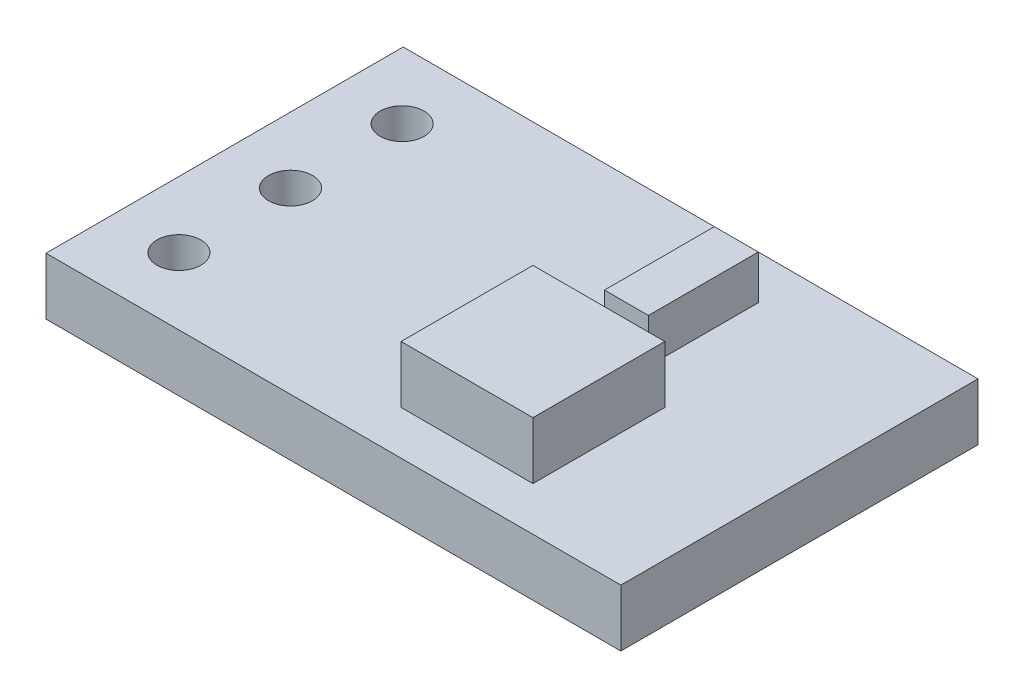
ISO-10303-21;
HEADER;
FILE_DESCRIPTION(('STEP AP214'),'2;1');
FILE_NAME('part.step','',(''),(''),'','','');
FILE_SCHEMA(('AUTOMOTIVE_DESIGN { 1 0 10303 214 1 1 1 1 }'));
ENDSEC;
DATA;
#1=APPLICATION_CONTEXT('core data for automotive mechanical design processes');
#2=APPLICATION_PROTOCOL_DEFINITION('international standard','automotive_design',2000,#1);
#3=PRODUCT_CONTEXT('',#1,'mechanical');
#4=PRODUCT('Part','Part','',(#3));
#5=PRODUCT_RELATED_PRODUCT_CATEGORY('part','',(#4));
#6=PRODUCT_DEFINITION_FORMATION('','',#4);
#7=PRODUCT_DEFINITION_CONTEXT('part definition',#1,'design');
#8=PRODUCT_DEFINITION('design','',#6,#7);
#9=PRODUCT_DEFINITION_SHAPE('','',#8);
#10=(LENGTH_UNIT() NAMED_UNIT(*) SI_UNIT(.MILLI.,.METRE.));
#11=(NAMED_UNIT(*) PLANE_ANGLE_UNIT() SI_UNIT($,.RADIAN.));
#12=(NAMED_UNIT(*) SI_UNIT($,.STERADIAN.) SOLID_ANGLE_UNIT());
#13=UNCERTAINTY_MEASURE_WITH_UNIT(LENGTH_MEASURE(1.E-05),#10,'distance_accuracy_value','');
#14=(GEOMETRIC_REPRESENTATION_CONTEXT(3) GLOBAL_UNCERTAINTY_ASSIGNED_CONTEXT((#13)) GLOBAL_UNIT_ASSIGNED_CONTEXT((#10,
#11,#12)) REPRESENTATION_CONTEXT('',''));
#15=CARTESIAN_POINT('',(0.,0.,0.));
#16=DIRECTION('',(0.,0.,1.));
#17=DIRECTION('',(1.,0.,0.));
#18=AXIS2_PLACEMENT_3D('',#15,#16,#17);
#19=CARTESIAN_POINT('',(0.,1.3,0.));
#20=DIRECTION('',(0.,1.,0.));
#21=DIRECTION('',(0.,0.,1.));
#22=AXIS2_PLACEMENT_3D('',#19,#20,#21);
#23=PLANE('',#22);
#24=CARTESIAN_POINT('',(-5.0405,1.3,0.));
#25=DIRECTION('',(0.,1.,0.));
#26=DIRECTION('',(0.,0.,1.));
#27=AXIS2_PLACEMENT_3D('',#24,#25,#26);
#28=CIRCLE('',#27,0.500000000000001);
#29=CARTESIAN_POINT('',(-5.0405,1.3,0.500000000000002));
#30=VERTEX_POINT('',#29);
#31=EDGE_CURVE('E185',#30,#30,#28,.T.);
#32=ORIENTED_EDGE('',*,*,#31,.F.);
#33=EDGE_LOOP('',(#32));
#34=FACE_BOUND('',#33,.T.);
#35=DIRECTION('',(0.,0.,1.));
#36=VECTOR('',#35,1.);
#37=CARTESIAN_POINT('',(-6.5405,1.3,4.064));
#38=LINE('',#37,#36);
#39=CARTESIAN_POINT('',(-6.5405,1.3,-4.064));
#40=VERTEX_POINT('',#39);
#41=CARTESIAN_POINT('',(-6.5405,1.3,4.064));
#42=VERTEX_POINT('',#41);
#43=EDGE_CURVE('E197',#40,#42,#38,.T.);
#44=ORIENTED_EDGE('',*,*,#43,.T.);
#45=DIRECTION('',(1.,0.,0.));
#46=VECTOR('',#45,1.);
#47=CARTESIAN_POINT('',(6.5405,1.3,4.064));
#48=LINE('',#47,#46);
#49=CARTESIAN_POINT('',(6.5405,1.3,4.064));
#50=VERTEX_POINT('',#49);
#51=EDGE_CURVE('E200',#42,#50,#48,.T.);
#52=ORIENTED_EDGE('',*,*,#51,.T.);
#53=DIRECTION('',(0.,0.,-1.));
#54=VECTOR('',#53,1.);
#55=CARTESIAN_POINT('',(6.5405,1.3,4.064));
#56=LINE('',#55,#54);
#57=CARTESIAN_POINT('',(6.5405,1.3,-4.064));
#58=VERTEX_POINT('',#57);
#59=EDGE_CURVE('E203',#50,#58,#56,.T.);
#60=ORIENTED_EDGE('',*,*,#59,.T.);
#61=DIRECTION('',(-1.,0.,0.));
#62=VECTOR('',#61,1.);
#63=CARTESIAN_POINT('',(6.5405,1.3,-4.064));
#64=LINE('',#63,#62);
#65=EDGE_CURVE('E205',#58,#40,#64,.T.);
#66=ORIENTED_EDGE('',*,*,#65,.T.);
#67=EDGE_LOOP('',(#44,#52,#60,#66));
#68=FACE_BOUND('',#67,.T.);
#69=CARTESIAN_POINT('',(-5.0405,1.3,-2.54));
#70=DIRECTION('',(0.,1.,0.));
#71=DIRECTION('',(0.,0.,1.));
#72=AXIS2_PLACEMENT_3D('',#69,#70,#71);
#73=CIRCLE('',#72,0.5);
#74=CARTESIAN_POINT('',(-5.0405,1.3,-2.04));
#75=VERTEX_POINT('',#74);
#76=EDGE_CURVE('E191',#75,#75,#73,.T.);
#77=ORIENTED_EDGE('',*,*,#76,.F.);
#78=EDGE_LOOP('',(#77));
#79=FACE_BOUND('',#78,.T.);
#80=CARTESIAN_POINT('',(-5.0405,1.3,2.54));
#81=DIRECTION('',(0.,1.,0.));
#82=DIRECTION('',(0.,0.,1.));
#83=AXIS2_PLACEMENT_3D('',#80,#81,#82);
#84=CIRCLE('',#83,0.500000000000001);
#85=CARTESIAN_POINT('',(-5.0405,1.3,3.04));
#86=VERTEX_POINT('',#85);
#87=EDGE_CURVE('E179',#86,#86,#84,.T.);
#88=ORIENTED_EDGE('',*,*,#87,.F.);
#89=EDGE_LOOP('',(#88));
#90=FACE_BOUND('',#89,.T.);
#91=DIRECTION('',(1.,0.,0.));
#92=VECTOR('',#91,1.);
#93=CARTESIAN_POINT('',(3.5405,1.3,3.064));
#94=LINE('',#93,#92);
#95=CARTESIAN_POINT('',(0.540500000000002,1.3,3.064));
#96=VERTEX_POINT('',#95);
#97=CARTESIAN_POINT('',(3.5405,1.3,3.064));
#98=VERTEX_POINT('',#97);
#99=EDGE_CURVE('E150',#96,#98,#94,.T.);
#100=ORIENTED_EDGE('',*,*,#99,.F.);
#101=DIRECTION('',(0.,0.,1.));
#102=VECTOR('',#101,1.);
#103=CARTESIAN_POINT('',(0.540500000000002,1.3,0.0640000000000027));
#104=LINE('',#103,#102);
#105=CARTESIAN_POINT('',(0.540500000000002,1.3,0.0640000000000027));
#106=VERTEX_POINT('',#105);
#107=EDGE_CURVE('E147',#106,#96,#104,.T.);
#108=ORIENTED_EDGE('',*,*,#107,.F.);
#109=DIRECTION('',(-1.,0.,0.));
#110=VECTOR('',#109,1.);
#111=CARTESIAN_POINT('',(3.5405,1.3,0.0640000000000023));
#112=LINE('',#111,#110);
#113=CARTESIAN_POINT('',(3.5405,1.3,0.0640000000000023));
#114=VERTEX_POINT('',#113);
#115=EDGE_CURVE('E159',#114,#106,#112,.T.);
#116=ORIENTED_EDGE('',*,*,#115,.F.);
#117=DIRECTION('',(0.,0.,-1.));
#118=VECTOR('',#117,1.);
#119=CARTESIAN_POINT('',(3.5405,1.3,0.0640000000000023));
#120=LINE('',#119,#118);
#121=EDGE_CURVE('E167',#98,#114,#120,.T.);
#122=ORIENTED_EDGE('',*,*,#121,.F.);
#123=EDGE_LOOP('',(#100,#108,#116,#122));
#124=FACE_BOUND('',#123,.T.);
#125=DIRECTION('',(1.,0.,0.));
#126=VECTOR('',#125,1.);
#127=CARTESIAN_POINT('',(2.5405,1.3,-0.563999999999999));
#128=LINE('',#127,#126);
#129=CARTESIAN_POINT('',(1.5405,1.3,-0.563999999999999));
#130=VERTEX_POINT('',#129);
#131=CARTESIAN_POINT('',(2.5405,1.3,-0.563999999999999));
#132=VERTEX_POINT('',#131);
#133=EDGE_CURVE('E427',#130,#132,#128,.T.);
#134=ORIENTED_EDGE('',*,*,#133,.F.);
#135=DIRECTION('',(0.,0.,1.));
#136=VECTOR('',#135,1.);
#137=CARTESIAN_POINT('',(1.5405,1.3,-3.064));
#138=LINE('',#137,#136);
#139=CARTESIAN_POINT('',(1.5405,1.3,-3.064));
#140=VERTEX_POINT('',#139);
#141=EDGE_CURVE('E145',#140,#130,#138,.T.);
#142=ORIENTED_EDGE('',*,*,#141,.F.);
#143=DIRECTION('',(-1.,0.,0.));
#144=VECTOR('',#143,1.);
#145=CARTESIAN_POINT('',(2.5405,1.3,-3.064));
#146=LINE('',#145,#144);
#147=CARTESIAN_POINT('',(2.5405,1.3,-3.064));
#148=VERTEX_POINT('',#147);
#149=EDGE_CURVE('E141',#148,#140,#146,.T.);
#150=ORIENTED_EDGE('',*,*,#149,.F.);
#151=DIRECTION('',(0.,0.,-1.));
#152=VECTOR('',#151,1.);
#153=CARTESIAN_POINT('',(2.5405,1.3,-3.064));
#154=LINE('',#153,#152);
#155=EDGE_CURVE('E424',#132,#148,#154,.T.);
#156=ORIENTED_EDGE('',*,*,#155,.F.);
#157=EDGE_LOOP('',(#134,#142,#150,#156));
#158=FACE_BOUND('',#157,.T.);
#159=ADVANCED_FACE('F32',(#34,#68,#79,#90,#124,#158),#23,.T.);
#160=CARTESIAN_POINT('',(0.,0.,0.));
#161=DIRECTION('',(0.,1.,0.));
#162=DIRECTION('',(0.,0.,1.));
#163=AXIS2_PLACEMENT_3D('',#160,#161,#162);
#164=PLANE('',#163);
#165=DIRECTION('',(0.,0.,1.));
#166=VECTOR('',#165,1.);
#167=CARTESIAN_POINT('',(-6.5405,0.,4.064));
#168=LINE('',#167,#166);
#169=CARTESIAN_POINT('',(-6.5405,0.,-4.064));
#170=VERTEX_POINT('',#169);
#171=CARTESIAN_POINT('',(-6.5405,0.,4.064));
#172=VERTEX_POINT('',#171);
#173=EDGE_CURVE('E194',#170,#172,#168,.T.);
#174=ORIENTED_EDGE('',*,*,#173,.F.);
#175=DIRECTION('',(-1.,0.,0.));
#176=VECTOR('',#175,1.);
#177=CARTESIAN_POINT('',(6.5405,0.,-4.064));
#178=LINE('',#177,#176);
#179=CARTESIAN_POINT('',(6.5405,0.,-4.064));
#180=VERTEX_POINT('',#179);
#181=EDGE_CURVE('E201',#180,#170,#178,.T.);
#182=ORIENTED_EDGE('',*,*,#181,.F.);
#183=DIRECTION('',(0.,0.,-1.));
#184=VECTOR('',#183,1.);
#185=CARTESIAN_POINT('',(6.5405,0.,4.064));
#186=LINE('',#185,#184);
#187=CARTESIAN_POINT('',(6.5405,0.,4.064));
#188=VERTEX_POINT('',#187);
#189=EDGE_CURVE('E212',#188,#180,#186,.T.);
#190=ORIENTED_EDGE('',*,*,#189,.F.);
#191=DIRECTION('',(1.,0.,0.));
#192=VECTOR('',#191,1.);
#193=CARTESIAN_POINT('',(6.5405,0.,4.064));
#194=LINE('',#193,#192);
#195=EDGE_CURVE('E210',#172,#188,#194,.T.);
#196=ORIENTED_EDGE('',*,*,#195,.F.);
#197=EDGE_LOOP('',(#174,#182,#190,#196));
#198=FACE_BOUND('',#197,.T.);
#199=CARTESIAN_POINT('',(-5.0405,0.,-2.54));
#200=DIRECTION('',(0.,1.,0.));
#201=DIRECTION('',(0.,0.,1.));
#202=AXIS2_PLACEMENT_3D('',#199,#200,#201);
#203=CIRCLE('',#202,0.5);
#204=CARTESIAN_POINT('',(-5.0405,0.,-2.04));
#205=VERTEX_POINT('',#204);
#206=EDGE_CURVE('E188',#205,#205,#203,.T.);
#207=ORIENTED_EDGE('',*,*,#206,.T.);
#208=EDGE_LOOP('',(#207));
#209=FACE_BOUND('',#208,.T.);
#210=CARTESIAN_POINT('',(-5.0405,0.,0.));
#211=DIRECTION('',(0.,1.,0.));
#212=DIRECTION('',(0.,0.,1.));
#213=AXIS2_PLACEMENT_3D('',#210,#211,#212);
#214=CIRCLE('',#213,0.500000000000001);
#215=CARTESIAN_POINT('',(-5.0405,0.,0.500000000000002));
#216=VERTEX_POINT('',#215);
#217=EDGE_CURVE('E182',#216,#216,#214,.T.);
#218=ORIENTED_EDGE('',*,*,#217,.T.);
#219=EDGE_LOOP('',(#218));
#220=FACE_BOUND('',#219,.T.);
#221=CARTESIAN_POINT('',(-5.0405,0.,2.54));
#222=DIRECTION('',(0.,1.,0.));
#223=DIRECTION('',(0.,0.,1.));
#224=AXIS2_PLACEMENT_3D('',#221,#222,#223);
#225=CIRCLE('',#224,0.500000000000001);
#226=CARTESIAN_POINT('',(-5.0405,0.,3.04));
#227=VERTEX_POINT('',#226);
#228=EDGE_CURVE('E178',#227,#227,#225,.T.);
#229=ORIENTED_EDGE('',*,*,#228,.T.);
#230=EDGE_LOOP('',(#229));
#231=FACE_BOUND('',#230,.T.);
#232=ADVANCED_FACE('F230',(#198,#209,#220,#231),#164,.F.);
#233=CARTESIAN_POINT('',(-6.5405,1.3,4.064));
#234=DIRECTION('',(1.,0.,0.));
#235=DIRECTION('',(0.,0.,-1.));
#236=AXIS2_PLACEMENT_3D('',#233,#234,#235);
#237=PLANE('',#236);
#238=ORIENTED_EDGE('',*,*,#173,.T.);
#239=DIRECTION('',(0.,-1.,0.));
#240=VECTOR('',#239,1.);
#241=CARTESIAN_POINT('',(-6.5405,1.3,4.064));
#242=LINE('',#241,#240);
#243=EDGE_CURVE('E11',#42,#172,#242,.T.);
#244=ORIENTED_EDGE('',*,*,#243,.F.);
#245=ORIENTED_EDGE('',*,*,#43,.F.);
#246=DIRECTION('',(0.,-1.,0.));
#247=VECTOR('',#246,1.);
#248=CARTESIAN_POINT('',(-6.5405,1.3,-4.064));
#249=LINE('',#248,#247);
#250=EDGE_CURVE('E207',#40,#170,#249,.T.);
#251=ORIENTED_EDGE('',*,*,#250,.T.);
#252=EDGE_LOOP('',(#238,#244,#245,#251));
#253=FACE_BOUND('',#252,.T.);
#254=ADVANCED_FACE('F34',(#253),#237,.F.);
#255=CARTESIAN_POINT('',(6.5405,1.3,4.064));
#256=DIRECTION('',(0.,0.,-1.));
#257=DIRECTION('',(-1.,0.,0.));
#258=AXIS2_PLACEMENT_3D('',#255,#256,#257);
#259=PLANE('',#258);
#260=ORIENTED_EDGE('',*,*,#195,.T.);
#261=DIRECTION('',(0.,-1.,0.));
#262=VECTOR('',#261,1.);
#263=CARTESIAN_POINT('',(6.5405,1.3,4.064));
#264=LINE('',#263,#262);
#265=EDGE_CURVE('E40',#50,#188,#264,.T.);
#266=ORIENTED_EDGE('',*,*,#265,.F.);
#267=ORIENTED_EDGE('',*,*,#51,.F.);
#268=ORIENTED_EDGE('',*,*,#243,.T.);
#269=EDGE_LOOP('',(#260,#266,#267,#268));
#270=FACE_BOUND('',#269,.T.);
#271=ADVANCED_FACE('F241',(#270),#259,.F.);
#272=CARTESIAN_POINT('',(6.5405,1.3,4.064));
#273=DIRECTION('',(-1.,0.,0.));
#274=DIRECTION('',(0.,0.,1.));
#275=AXIS2_PLACEMENT_3D('',#272,#273,#274);
#276=PLANE('',#275);
#277=ORIENTED_EDGE('',*,*,#189,.T.);
#278=DIRECTION('',(0.,-1.,0.));
#279=VECTOR('',#278,1.);
#280=CARTESIAN_POINT('',(6.5405,1.3,-4.064));
#281=LINE('',#280,#279);
#282=EDGE_CURVE('E217',#58,#180,#281,.T.);
#283=ORIENTED_EDGE('',*,*,#282,.F.);
#284=ORIENTED_EDGE('',*,*,#59,.F.);
#285=ORIENTED_EDGE('',*,*,#265,.T.);
#286=EDGE_LOOP('',(#277,#283,#284,#285));
#287=FACE_BOUND('',#286,.T.);
#288=ADVANCED_FACE('F224',(#287),#276,.F.);
#289=CARTESIAN_POINT('',(6.5405,1.3,-4.064));
#290=DIRECTION('',(0.,0.,1.));
#291=DIRECTION('',(1.,0.,0.));
#292=AXIS2_PLACEMENT_3D('',#289,#290,#291);
#293=PLANE('',#292);
#294=ORIENTED_EDGE('',*,*,#181,.T.);
#295=ORIENTED_EDGE('',*,*,#250,.F.);
#296=ORIENTED_EDGE('',*,*,#65,.F.);
#297=ORIENTED_EDGE('',*,*,#282,.T.);
#298=EDGE_LOOP('',(#294,#295,#296,#297));
#299=FACE_BOUND('',#298,.T.);
#300=ADVANCED_FACE('F234',(#299),#293,.F.);
#301=CARTESIAN_POINT('',(-5.0405,1.3,-2.54));
#302=DIRECTION('',(0.,-1.,0.));
#303=DIRECTION('',(0.,0.,-1.));
#304=AXIS2_PLACEMENT_3D('',#301,#302,#303);
#305=CYLINDRICAL_SURFACE('',#304,0.5);
#306=ORIENTED_EDGE('',*,*,#76,.T.);
#307=EDGE_LOOP('',(#306));
#308=FACE_BOUND('',#307,.T.);
#309=ORIENTED_EDGE('',*,*,#206,.F.);
#310=EDGE_LOOP('',(#309));
#311=FACE_BOUND('',#310,.T.);
#312=ADVANCED_FACE('F257',(#308,#311),#305,.F.);
#313=CARTESIAN_POINT('',(-5.0405,1.3,0.));
#314=DIRECTION('',(0.,-1.,0.));
#315=DIRECTION('',(0.,0.,-1.));
#316=AXIS2_PLACEMENT_3D('',#313,#314,#315);
#317=CYLINDRICAL_SURFACE('',#316,0.500000000000001);
#318=ORIENTED_EDGE('',*,*,#31,.T.);
#319=EDGE_LOOP('',(#318));
#320=FACE_BOUND('',#319,.T.);
#321=ORIENTED_EDGE('',*,*,#217,.F.);
#322=EDGE_LOOP('',(#321));
#323=FACE_BOUND('',#322,.T.);
#324=ADVANCED_FACE('F264',(#320,#323),#317,.F.);
#325=CARTESIAN_POINT('',(-5.0405,1.3,2.54));
#326=DIRECTION('',(0.,-1.,0.));
#327=DIRECTION('',(0.,0.,-1.));
#328=AXIS2_PLACEMENT_3D('',#325,#326,#327);
#329=CYLINDRICAL_SURFACE('',#328,0.500000000000001);
#330=ORIENTED_EDGE('',*,*,#87,.T.);
#331=EDGE_LOOP('',(#330));
#332=FACE_BOUND('',#331,.T.);
#333=ORIENTED_EDGE('',*,*,#228,.F.);
#334=EDGE_LOOP('',(#333));
#335=FACE_BOUND('',#334,.T.);
#336=ADVANCED_FACE('F269',(#332,#335),#329,.F.);
#337=CARTESIAN_POINT('',(0.540500000000002,2.6,0.0640000000000027));
#338=DIRECTION('',(1.,0.,0.));
#339=DIRECTION('',(0.,0.,-1.));
#340=AXIS2_PLACEMENT_3D('',#337,#338,#339);
#341=PLANE('',#340);
#342=ORIENTED_EDGE('',*,*,#107,.T.);
#343=DIRECTION('',(0.,-1.,0.));
#344=VECTOR('',#343,1.);
#345=CARTESIAN_POINT('',(0.540500000000002,2.6,3.064));
#346=LINE('',#345,#344);
#347=CARTESIAN_POINT('',(0.540500000000002,2.6,3.064));
#348=VERTEX_POINT('',#347);
#349=EDGE_CURVE('E176',#348,#96,#346,.T.);
#350=ORIENTED_EDGE('',*,*,#349,.F.);
#351=DIRECTION('',(0.,0.,1.));
#352=VECTOR('',#351,1.);
#353=CARTESIAN_POINT('',(0.540500000000002,2.6,0.0640000000000027));
#354=LINE('',#353,#352);
#355=CARTESIAN_POINT('',(0.540500000000002,2.6,0.0640000000000027));
#356=VERTEX_POINT('',#355);
#357=EDGE_CURVE('E155',#356,#348,#354,.T.);
#358=ORIENTED_EDGE('',*,*,#357,.F.);
#359=DIRECTION('',(0.,-1.,0.));
#360=VECTOR('',#359,1.);
#361=CARTESIAN_POINT('',(0.540500000000002,2.6,0.0640000000000027));
#362=LINE('',#361,#360);
#363=EDGE_CURVE('E164',#356,#106,#362,.T.);
#364=ORIENTED_EDGE('',*,*,#363,.T.);
#365=EDGE_LOOP('',(#342,#350,#358,#364));
#366=FACE_BOUND('',#365,.T.);
#367=ADVANCED_FACE('F280',(#366),#341,.F.);
#368=CARTESIAN_POINT('',(3.5405,2.6,3.064));
#369=DIRECTION('',(0.,0.,-1.));
#370=DIRECTION('',(-1.,0.,0.));
#371=AXIS2_PLACEMENT_3D('',#368,#369,#370);
#372=PLANE('',#371);
#373=ORIENTED_EDGE('',*,*,#99,.T.);
#374=DIRECTION('',(0.,-1.,0.));
#375=VECTOR('',#374,1.);
#376=CARTESIAN_POINT('',(3.5405,2.6,3.064));
#377=LINE('',#376,#375);
#378=CARTESIAN_POINT('',(3.5405,2.6,3.064));
#379=VERTEX_POINT('',#378);
#380=EDGE_CURVE('E173',#379,#98,#377,.T.);
#381=ORIENTED_EDGE('',*,*,#380,.F.);
#382=DIRECTION('',(1.,0.,0.));
#383=VECTOR('',#382,1.);
#384=CARTESIAN_POINT('',(3.5405,2.6,3.064));
#385=LINE('',#384,#383);
#386=EDGE_CURVE('E158',#348,#379,#385,.T.);
#387=ORIENTED_EDGE('',*,*,#386,.F.);
#388=ORIENTED_EDGE('',*,*,#349,.T.);
#389=EDGE_LOOP('',(#373,#381,#387,#388));
#390=FACE_BOUND('',#389,.T.);
#391=ADVANCED_FACE('F286',(#390),#372,.F.);
#392=CARTESIAN_POINT('',(3.5405,2.6,0.0640000000000023));
#393=DIRECTION('',(-1.,0.,0.));
#394=DIRECTION('',(0.,0.,1.));
#395=AXIS2_PLACEMENT_3D('',#392,#393,#394);
#396=PLANE('',#395);
#397=ORIENTED_EDGE('',*,*,#121,.T.);
#398=DIRECTION('',(0.,-1.,0.));
#399=VECTOR('',#398,1.);
#400=CARTESIAN_POINT('',(3.5405,2.6,0.0640000000000023));
#401=LINE('',#400,#399);
#402=CARTESIAN_POINT('',(3.5405,2.6,0.0640000000000023));
#403=VERTEX_POINT('',#402);
#404=EDGE_CURVE('E55',#403,#114,#401,.T.);
#405=ORIENTED_EDGE('',*,*,#404,.F.);
#406=DIRECTION('',(0.,0.,-1.));
#407=VECTOR('',#406,1.);
#408=CARTESIAN_POINT('',(3.5405,2.6,0.0640000000000023));
#409=LINE('',#408,#407);
#410=EDGE_CURVE('E161',#379,#403,#409,.T.);
#411=ORIENTED_EDGE('',*,*,#410,.F.);
#412=ORIENTED_EDGE('',*,*,#380,.T.);
#413=EDGE_LOOP('',(#397,#405,#411,#412));
#414=FACE_BOUND('',#413,.T.);
#415=ADVANCED_FACE('F292',(#414),#396,.F.);
#416=CARTESIAN_POINT('',(3.5405,2.6,0.0640000000000023));
#417=DIRECTION('',(0.,0.,1.));
#418=DIRECTION('',(1.,0.,0.));
#419=AXIS2_PLACEMENT_3D('',#416,#417,#418);
#420=PLANE('',#419);
#421=ORIENTED_EDGE('',*,*,#115,.T.);
#422=ORIENTED_EDGE('',*,*,#363,.F.);
#423=DIRECTION('',(-1.,0.,0.));
#424=VECTOR('',#423,1.);
#425=CARTESIAN_POINT('',(3.5405,2.6,0.0640000000000023));
#426=LINE('',#425,#424);
#427=EDGE_CURVE('E163',#403,#356,#426,.T.);
#428=ORIENTED_EDGE('',*,*,#427,.F.);
#429=ORIENTED_EDGE('',*,*,#404,.T.);
#430=EDGE_LOOP('',(#421,#422,#428,#429));
#431=FACE_BOUND('',#430,.T.);
#432=ADVANCED_FACE('F296',(#431),#420,.F.);
#433=CARTESIAN_POINT('',(0.,2.6,0.));
#434=DIRECTION('',(0.,-1.,0.));
#435=DIRECTION('',(0.,0.,-1.));
#436=AXIS2_PLACEMENT_3D('',#433,#434,#435);
#437=PLANE('',#436);
#438=ORIENTED_EDGE('',*,*,#357,.T.);
#439=ORIENTED_EDGE('',*,*,#386,.T.);
#440=ORIENTED_EDGE('',*,*,#410,.T.);
#441=ORIENTED_EDGE('',*,*,#427,.T.);
#442=EDGE_LOOP('',(#438,#439,#440,#441));
#443=FACE_BOUND('',#442,.T.);
#444=ADVANCED_FACE('F300',(#443),#437,.F.);
#445=CARTESIAN_POINT('',(1.5405,2.3,-3.064));
#446=DIRECTION('',(1.,0.,0.));
#447=DIRECTION('',(0.,0.,-1.));
#448=AXIS2_PLACEMENT_3D('',#445,#446,#447);
#449=PLANE('',#448);
#450=ORIENTED_EDGE('',*,*,#141,.T.);
#451=DIRECTION('',(0.,-1.,0.));
#452=VECTOR('',#451,1.);
#453=CARTESIAN_POINT('',(1.5405,2.3,-0.563999999999999));
#454=LINE('',#453,#452);
#455=CARTESIAN_POINT('',(1.5405,2.3,-0.563999999999999));
#456=VERTEX_POINT('',#455);
#457=EDGE_CURVE('E126',#456,#130,#454,.T.);
#458=ORIENTED_EDGE('',*,*,#457,.F.);
#459=DIRECTION('',(0.,0.,1.));
#460=VECTOR('',#459,1.);
#461=CARTESIAN_POINT('',(1.5405,2.3,-3.064));
#462=LINE('',#461,#460);
#463=CARTESIAN_POINT('',(1.5405,2.3,-3.064));
#464=VERTEX_POINT('',#463);
#465=EDGE_CURVE('E133',#464,#456,#462,.T.);
#466=ORIENTED_EDGE('',*,*,#465,.F.);
#467=DIRECTION('',(0.,-1.,0.));
#468=VECTOR('',#467,1.);
#469=CARTESIAN_POINT('',(1.5405,2.3,-3.064));
#470=LINE('',#469,#468);
#471=EDGE_CURVE('E421',#464,#140,#470,.T.);
#472=ORIENTED_EDGE('',*,*,#471,.T.);
#473=EDGE_LOOP('',(#450,#458,#466,#472));
#474=FACE_BOUND('',#473,.T.);
#475=ADVANCED_FACE('F143',(#474),#449,.F.);
#476=CARTESIAN_POINT('',(2.5405,2.3,-0.563999999999999));
#477=DIRECTION('',(0.,0.,-1.));
#478=DIRECTION('',(-1.,0.,0.));
#479=AXIS2_PLACEMENT_3D('',#476,#477,#478);
#480=PLANE('',#479);
#481=ORIENTED_EDGE('',*,*,#133,.T.);
#482=DIRECTION('',(0.,-1.,0.));
#483=VECTOR('',#482,1.);
#484=CARTESIAN_POINT('',(2.5405,2.3,-0.563999999999999));
#485=LINE('',#484,#483);
#486=CARTESIAN_POINT('',(2.5405,2.3,-0.563999999999999));
#487=VERTEX_POINT('',#486);
#488=EDGE_CURVE('E129',#487,#132,#485,.T.);
#489=ORIENTED_EDGE('',*,*,#488,.F.);
#490=DIRECTION('',(1.,0.,0.));
#491=VECTOR('',#490,1.);
#492=CARTESIAN_POINT('',(2.5405,2.3,-0.563999999999999));
#493=LINE('',#492,#491);
#494=EDGE_CURVE('E122',#456,#487,#493,.T.);
#495=ORIENTED_EDGE('',*,*,#494,.F.);
#496=ORIENTED_EDGE('',*,*,#457,.T.);
#497=EDGE_LOOP('',(#481,#489,#495,#496));
#498=FACE_BOUND('',#497,.T.);
#499=ADVANCED_FACE('F124',(#498),#480,.F.);
#500=CARTESIAN_POINT('',(2.5405,2.3,-3.064));
#501=DIRECTION('',(-1.,0.,0.));
#502=DIRECTION('',(0.,0.,1.));
#503=AXIS2_PLACEMENT_3D('',#500,#501,#502);
#504=PLANE('',#503);
#505=ORIENTED_EDGE('',*,*,#155,.T.);
#506=DIRECTION('',(0.,-1.,0.));
#507=VECTOR('',#506,1.);
#508=CARTESIAN_POINT('',(2.5405,2.3,-3.064));
#509=LINE('',#508,#507);
#510=CARTESIAN_POINT('',(2.5405,2.3,-3.064));
#511=VERTEX_POINT('',#510);
#512=EDGE_CURVE('E47',#511,#148,#509,.T.);
#513=ORIENTED_EDGE('',*,*,#512,.F.);
#514=DIRECTION('',(0.,0.,-1.));
#515=VECTOR('',#514,1.);
#516=CARTESIAN_POINT('',(2.5405,2.3,-3.064));
#517=LINE('',#516,#515);
#518=EDGE_CURVE('E132',#487,#511,#517,.T.);
#519=ORIENTED_EDGE('',*,*,#518,.F.);
#520=ORIENTED_EDGE('',*,*,#488,.T.);
#521=EDGE_LOOP('',(#505,#513,#519,#520));
#522=FACE_BOUND('',#521,.T.);
#523=ADVANCED_FACE('F308',(#522),#504,.F.);
#524=CARTESIAN_POINT('',(2.5405,2.3,-3.064));
#525=DIRECTION('',(0.,0.,1.));
#526=DIRECTION('',(1.,0.,0.));
#527=AXIS2_PLACEMENT_3D('',#524,#525,#526);
#528=PLANE('',#527);
#529=ORIENTED_EDGE('',*,*,#149,.T.);
#530=ORIENTED_EDGE('',*,*,#471,.F.);
#531=DIRECTION('',(-1.,0.,0.));
#532=VECTOR('',#531,1.);
#533=CARTESIAN_POINT('',(2.5405,2.3,-3.064));
#534=LINE('',#533,#532);
#535=EDGE_CURVE('E137',#511,#464,#534,.T.);
#536=ORIENTED_EDGE('',*,*,#535,.F.);
#537=ORIENTED_EDGE('',*,*,#512,.T.);
#538=EDGE_LOOP('',(#529,#530,#536,#537));
#539=FACE_BOUND('',#538,.T.);
#540=ADVANCED_FACE('F311',(#539),#528,.F.);
#541=CARTESIAN_POINT('',(0.,2.3,0.));
#542=DIRECTION('',(0.,-1.,0.));
#543=DIRECTION('',(0.,0.,-1.));
#544=AXIS2_PLACEMENT_3D('',#541,#542,#543);
#545=PLANE('',#544);
#546=ORIENTED_EDGE('',*,*,#465,.T.);
#547=ORIENTED_EDGE('',*,*,#494,.T.);
#548=ORIENTED_EDGE('',*,*,#518,.T.);
#549=ORIENTED_EDGE('',*,*,#535,.T.);
#550=EDGE_LOOP('',(#546,#547,#548,#549));
#551=FACE_BOUND('',#550,.T.);
#552=ADVANCED_FACE('F136',(#551),#545,.F.);
#553=CLOSED_SHELL('',(#159,#232,#254,#271,#288,#300,#312,#324,#336,#367,#391,#415,#432,#444,
#475,#499,#523,#540,#552));
#554=MANIFOLD_SOLID_BREP('B2',#553);
#555=ADVANCED_BREP_SHAPE_REPRESENTATION('',(#18,#554),#14);
#556=SHAPE_DEFINITION_REPRESENTATION(#9,#555);
ENDSEC;
END-ISO-10303-21;
